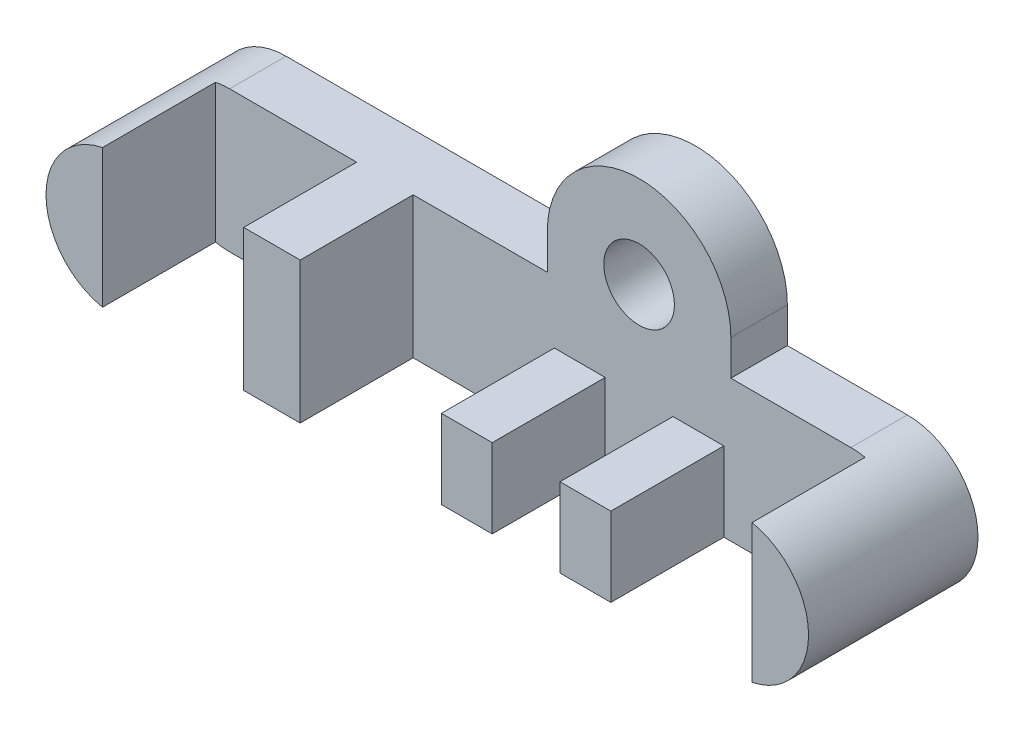
ISO-10303-21;
HEADER;
FILE_DESCRIPTION(('STEP AP214'),'2;1');
FILE_NAME('part.step','',(''),(''),'','','');
FILE_SCHEMA(('AUTOMOTIVE_DESIGN { 1 0 10303 214 1 1 1 1 }'));
ENDSEC;
DATA;
#1=APPLICATION_CONTEXT('core data for automotive mechanical design processes');
#2=APPLICATION_PROTOCOL_DEFINITION('international standard','automotive_design',2000,#1);
#3=PRODUCT_CONTEXT('',#1,'mechanical');
#4=PRODUCT('Part','Part','',(#3));
#5=PRODUCT_RELATED_PRODUCT_CATEGORY('part','',(#4));
#6=PRODUCT_DEFINITION_FORMATION('','',#4);
#7=PRODUCT_DEFINITION_CONTEXT('part definition',#1,'design');
#8=PRODUCT_DEFINITION('design','',#6,#7);
#9=PRODUCT_DEFINITION_SHAPE('','',#8);
#10=(LENGTH_UNIT() NAMED_UNIT(*) SI_UNIT(.MILLI.,.METRE.));
#11=(NAMED_UNIT(*) PLANE_ANGLE_UNIT() SI_UNIT($,.RADIAN.));
#12=(NAMED_UNIT(*) SI_UNIT($,.STERADIAN.) SOLID_ANGLE_UNIT());
#13=UNCERTAINTY_MEASURE_WITH_UNIT(LENGTH_MEASURE(1.E-05),#10,'distance_accuracy_value','');
#14=(GEOMETRIC_REPRESENTATION_CONTEXT(3) GLOBAL_UNCERTAINTY_ASSIGNED_CONTEXT((#13)) GLOBAL_UNIT_ASSIGNED_CONTEXT((#10,
#11,#12)) REPRESENTATION_CONTEXT('',''));
#15=CARTESIAN_POINT('',(0.,0.,0.));
#16=DIRECTION('',(0.,0.,1.));
#17=DIRECTION('',(1.,0.,0.));
#18=AXIS2_PLACEMENT_3D('',#15,#16,#17);
#19=CARTESIAN_POINT('',(-14.5,-3.75,2.));
#20=DIRECTION('',(0.,0.,1.));
#21=DIRECTION('',(1.,0.,0.));
#22=AXIS2_PLACEMENT_3D('',#19,#20,#21);
#23=PLANE('',#22);
#24=DIRECTION('',(1.,0.,0.));
#25=VECTOR('',#24,1.);
#26=CARTESIAN_POINT('',(-14.5,-6.25,2.));
#27=LINE('',#26,#25);
#28=CARTESIAN_POINT('',(-14.5,-6.25,2.));
#29=VERTEX_POINT('',#28);
#30=CARTESIAN_POINT('',(-10.,-6.25,2.));
#31=VERTEX_POINT('',#30);
#32=EDGE_CURVE('E69',#29,#31,#27,.T.);
#33=ORIENTED_EDGE('',*,*,#32,.T.);
#34=DIRECTION('',(0.,-1.,0.));
#35=VECTOR('',#34,1.);
#36=CARTESIAN_POINT('',(-10.,0.,2.));
#37=LINE('',#36,#35);
#38=CARTESIAN_POINT('',(-10.,-1.25,2.));
#39=VERTEX_POINT('',#38);
#40=EDGE_CURVE('E831',#39,#31,#37,.T.);
#41=ORIENTED_EDGE('',*,*,#40,.F.);
#42=DIRECTION('',(-1.,0.,0.));
#43=VECTOR('',#42,1.);
#44=CARTESIAN_POINT('',(-14.5,-1.25,2.));
#45=LINE('',#44,#43);
#46=CARTESIAN_POINT('',(-14.5,-1.25,2.));
#47=VERTEX_POINT('',#46);
#48=EDGE_CURVE('E232',#39,#47,#45,.T.);
#49=ORIENTED_EDGE('',*,*,#48,.T.);
#50=CARTESIAN_POINT('',(-14.5,-3.75,2.));
#51=DIRECTION('',(0.,0.,1.));
#52=DIRECTION('',(1.,0.,0.));
#53=AXIS2_PLACEMENT_3D('',#50,#51,#52);
#54=CIRCLE('',#53,2.5);
#55=CARTESIAN_POINT('',(-15.,-1.30051025721682,2.));
#56=VERTEX_POINT('',#55);
#57=EDGE_CURVE('E368',#47,#56,#54,.T.);
#58=ORIENTED_EDGE('',*,*,#57,.T.);
#59=DIRECTION('',(0.,-1.,0.));
#60=VECTOR('',#59,1.);
#61=CARTESIAN_POINT('',(-15.,0.,2.));
#62=LINE('',#61,#60);
#63=CARTESIAN_POINT('',(-15.,-6.19948974278318,2.));
#64=VERTEX_POINT('',#63);
#65=EDGE_CURVE('E234',#56,#64,#62,.T.);
#66=ORIENTED_EDGE('',*,*,#65,.T.);
#67=EDGE_CURVE('E372',#64,#29,#54,.T.);
#68=ORIENTED_EDGE('',*,*,#67,.T.);
#69=EDGE_LOOP('',(#33,#41,#49,#58,#66,#68));
#70=FACE_BOUND('',#69,.T.);
#71=ADVANCED_FACE('F45',(#70),#23,.T.);
#72=DIRECTION('',(0.,-1.,0.));
#73=VECTOR('',#72,1.);
#74=CARTESIAN_POINT('',(-8.,0.,2.));
#75=LINE('',#74,#73);
#76=CARTESIAN_POINT('',(-8.,-1.25,2.));
#77=VERTEX_POINT('',#76);
#78=CARTESIAN_POINT('',(-8.,-6.25,2.));
#79=VERTEX_POINT('',#78);
#80=EDGE_CURVE('E61',#77,#79,#75,.T.);
#81=ORIENTED_EDGE('',*,*,#80,.T.);
#82=CARTESIAN_POINT('',(-3.,-6.25,2.));
#83=VERTEX_POINT('',#82);
#84=EDGE_CURVE('E376',#79,#83,#27,.T.);
#85=ORIENTED_EDGE('',*,*,#84,.T.);
#86=DIRECTION('',(0.,-1.,0.));
#87=VECTOR('',#86,1.);
#88=CARTESIAN_POINT('',(-3.,0.,2.));
#89=LINE('',#88,#87);
#90=CARTESIAN_POINT('',(-3.,-3.45,2.));
#91=VERTEX_POINT('',#90);
#92=EDGE_CURVE('E325',#91,#83,#89,.T.);
#93=ORIENTED_EDGE('',*,*,#92,.F.);
#94=DIRECTION('',(1.,0.,0.));
#95=VECTOR('',#94,1.);
#96=CARTESIAN_POINT('',(0.,-3.45,2.));
#97=LINE('',#96,#95);
#98=CARTESIAN_POINT('',(-1.2,-3.45,2.));
#99=VERTEX_POINT('',#98);
#100=EDGE_CURVE('E339',#91,#99,#97,.T.);
#101=ORIENTED_EDGE('',*,*,#100,.T.);
#102=DIRECTION('',(0.,-1.,0.));
#103=VECTOR('',#102,1.);
#104=CARTESIAN_POINT('',(-1.2,0.,2.));
#105=LINE('',#104,#103);
#106=CARTESIAN_POINT('',(-1.2,-6.25,2.));
#107=VERTEX_POINT('',#106);
#108=EDGE_CURVE('E319',#99,#107,#105,.T.);
#109=ORIENTED_EDGE('',*,*,#108,.T.);
#110=CARTESIAN_POINT('',(1.2,-6.25,2.));
#111=VERTEX_POINT('',#110);
#112=EDGE_CURVE('E377',#107,#111,#27,.T.);
#113=ORIENTED_EDGE('',*,*,#112,.T.);
#114=DIRECTION('',(0.,-1.,0.));
#115=VECTOR('',#114,1.);
#116=CARTESIAN_POINT('',(1.2,0.,2.));
#117=LINE('',#116,#115);
#118=CARTESIAN_POINT('',(1.2,-3.45,2.));
#119=VERTEX_POINT('',#118);
#120=EDGE_CURVE('E297',#119,#111,#117,.T.);
#121=ORIENTED_EDGE('',*,*,#120,.F.);
#122=DIRECTION('',(1.,0.,0.));
#123=VECTOR('',#122,1.);
#124=CARTESIAN_POINT('',(0.,-3.45,2.));
#125=LINE('',#124,#123);
#126=CARTESIAN_POINT('',(3.,-3.45,2.));
#127=VERTEX_POINT('',#126);
#128=EDGE_CURVE('E278',#119,#127,#125,.T.);
#129=ORIENTED_EDGE('',*,*,#128,.T.);
#130=DIRECTION('',(0.,-1.,0.));
#131=VECTOR('',#130,1.);
#132=CARTESIAN_POINT('',(3.,0.,2.));
#133=LINE('',#132,#131);
#134=CARTESIAN_POINT('',(3.,-6.25,2.));
#135=VERTEX_POINT('',#134);
#136=EDGE_CURVE('E284',#127,#135,#133,.T.);
#137=ORIENTED_EDGE('',*,*,#136,.T.);
#138=CARTESIAN_POINT('',(7.5,-6.25,2.));
#139=VERTEX_POINT('',#138);
#140=EDGE_CURVE('E371',#135,#139,#27,.T.);
#141=ORIENTED_EDGE('',*,*,#140,.T.);
#142=CARTESIAN_POINT('',(7.5,-3.75,2.));
#143=DIRECTION('',(0.,0.,1.));
#144=DIRECTION('',(1.,0.,0.));
#145=AXIS2_PLACEMENT_3D('',#142,#143,#144);
#146=CIRCLE('',#145,2.5);
#147=CARTESIAN_POINT('',(8.,-6.19948974278318,2.));
#148=VERTEX_POINT('',#147);
#149=EDGE_CURVE('E378',#139,#148,#146,.T.);
#150=ORIENTED_EDGE('',*,*,#149,.T.);
#151=DIRECTION('',(0.,-1.,0.));
#152=VECTOR('',#151,1.);
#153=CARTESIAN_POINT('',(8.,0.,2.));
#154=LINE('',#153,#152);
#155=CARTESIAN_POINT('',(8.,-1.30051025721682,2.));
#156=VERTEX_POINT('',#155);
#157=EDGE_CURVE('E259',#156,#148,#154,.T.);
#158=ORIENTED_EDGE('',*,*,#157,.F.);
#159=CARTESIAN_POINT('',(7.5,-1.25,2.));
#160=VERTEX_POINT('',#159);
#161=EDGE_CURVE('E375',#156,#160,#146,.T.);
#162=ORIENTED_EDGE('',*,*,#161,.T.);
#163=DIRECTION('',(-1.,0.,0.));
#164=VECTOR('',#163,1.);
#165=CARTESIAN_POINT('',(3.25,-1.25,2.));
#166=LINE('',#165,#164);
#167=CARTESIAN_POINT('',(3.25,-1.25,2.));
#168=VERTEX_POINT('',#167);
#169=EDGE_CURVE('E381',#160,#168,#166,.T.);
#170=ORIENTED_EDGE('',*,*,#169,.T.);
#171=DIRECTION('',(0.,1.,0.));
#172=VECTOR('',#171,1.);
#173=CARTESIAN_POINT('',(3.25,0.,2.));
#174=LINE('',#173,#172);
#175=CARTESIAN_POINT('',(3.25,0.,2.));
#176=VERTEX_POINT('',#175);
#177=EDGE_CURVE('E384',#168,#176,#174,.T.);
#178=ORIENTED_EDGE('',*,*,#177,.T.);
#179=CARTESIAN_POINT('',(0.,0.,2.));
#180=DIRECTION('',(0.,0.,1.));
#181=DIRECTION('',(1.,0.,0.));
#182=AXIS2_PLACEMENT_3D('',#179,#180,#181);
#183=CIRCLE('',#182,3.25);
#184=CARTESIAN_POINT('',(-3.25,0.,2.));
#185=VERTEX_POINT('',#184);
#186=EDGE_CURVE('E387',#176,#185,#183,.T.);
#187=ORIENTED_EDGE('',*,*,#186,.T.);
#188=DIRECTION('',(0.,-1.,0.));
#189=VECTOR('',#188,1.);
#190=CARTESIAN_POINT('',(-3.25,0.,2.));
#191=LINE('',#190,#189);
#192=CARTESIAN_POINT('',(-3.25,-1.25,2.));
#193=VERTEX_POINT('',#192);
#194=EDGE_CURVE('E390',#185,#193,#191,.T.);
#195=ORIENTED_EDGE('',*,*,#194,.T.);
#196=EDGE_CURVE('E393',#193,#77,#45,.T.);
#197=ORIENTED_EDGE('',*,*,#196,.T.);
#198=EDGE_LOOP('',(#81,#85,#93,#101,#109,#113,#121,#129,#137,#141,#150,#158,#162,#170,#178,#187,
#195,#197));
#199=FACE_BOUND('',#198,.T.);
#200=CARTESIAN_POINT('',(0.,0.,2.));
#201=DIRECTION('',(0.,0.,1.));
#202=DIRECTION('',(1.,0.,0.));
#203=AXIS2_PLACEMENT_3D('',#200,#201,#202);
#204=CIRCLE('',#203,1.25);
#205=CARTESIAN_POINT('',(1.25,0.,2.));
#206=VERTEX_POINT('',#205);
#207=EDGE_CURVE('E360',#206,#206,#204,.T.);
#208=ORIENTED_EDGE('',*,*,#207,.F.);
#209=EDGE_LOOP('',(#208));
#210=FACE_BOUND('',#209,.T.);
#211=ADVANCED_FACE('F468',(#199,#210),#23,.T.);
#212=CARTESIAN_POINT('',(-14.5,-3.75,0.));
#213=DIRECTION('',(0.,0.,1.));
#214=DIRECTION('',(1.,0.,0.));
#215=AXIS2_PLACEMENT_3D('',#212,#213,#214);
#216=PLANE('',#215);
#217=CARTESIAN_POINT('',(-14.5,-3.75,0.));
#218=DIRECTION('',(0.,0.,1.));
#219=DIRECTION('',(1.,0.,0.));
#220=AXIS2_PLACEMENT_3D('',#217,#218,#219);
#221=CIRCLE('',#220,2.5);
#222=CARTESIAN_POINT('',(-14.5,-1.25,0.));
#223=VERTEX_POINT('',#222);
#224=CARTESIAN_POINT('',(-14.5,-6.25,0.));
#225=VERTEX_POINT('',#224);
#226=EDGE_CURVE('E364',#223,#225,#221,.T.);
#227=ORIENTED_EDGE('',*,*,#226,.F.);
#228=DIRECTION('',(-1.,0.,0.));
#229=VECTOR('',#228,1.);
#230=CARTESIAN_POINT('',(-14.5,-1.25,0.));
#231=LINE('',#230,#229);
#232=CARTESIAN_POINT('',(-3.25,-1.25,0.));
#233=VERTEX_POINT('',#232);
#234=EDGE_CURVE('E418',#233,#223,#231,.T.);
#235=ORIENTED_EDGE('',*,*,#234,.F.);
#236=DIRECTION('',(0.,-1.,0.));
#237=VECTOR('',#236,1.);
#238=CARTESIAN_POINT('',(-3.25,0.,0.));
#239=LINE('',#238,#237);
#240=CARTESIAN_POINT('',(-3.25,0.,0.));
#241=VERTEX_POINT('',#240);
#242=EDGE_CURVE('E415',#241,#233,#239,.T.);
#243=ORIENTED_EDGE('',*,*,#242,.F.);
#244=CARTESIAN_POINT('',(0.,0.,0.));
#245=DIRECTION('',(0.,0.,1.));
#246=DIRECTION('',(1.,0.,0.));
#247=AXIS2_PLACEMENT_3D('',#244,#245,#246);
#248=CIRCLE('',#247,3.25);
#249=CARTESIAN_POINT('',(3.25,0.,0.));
#250=VERTEX_POINT('',#249);
#251=EDGE_CURVE('E412',#250,#241,#248,.T.);
#252=ORIENTED_EDGE('',*,*,#251,.F.);
#253=DIRECTION('',(0.,1.,0.));
#254=VECTOR('',#253,1.);
#255=CARTESIAN_POINT('',(3.25,0.,0.));
#256=LINE('',#255,#254);
#257=CARTESIAN_POINT('',(3.25,-1.25,0.));
#258=VERTEX_POINT('',#257);
#259=EDGE_CURVE('E409',#258,#250,#256,.T.);
#260=ORIENTED_EDGE('',*,*,#259,.F.);
#261=DIRECTION('',(-1.,0.,0.));
#262=VECTOR('',#261,1.);
#263=CARTESIAN_POINT('',(3.25,-1.25,0.));
#264=LINE('',#263,#262);
#265=CARTESIAN_POINT('',(7.5,-1.25,0.));
#266=VERTEX_POINT('',#265);
#267=EDGE_CURVE('E406',#266,#258,#264,.T.);
#268=ORIENTED_EDGE('',*,*,#267,.F.);
#269=CARTESIAN_POINT('',(7.5,-3.75,0.));
#270=DIRECTION('',(0.,0.,1.));
#271=DIRECTION('',(1.,0.,0.));
#272=AXIS2_PLACEMENT_3D('',#269,#270,#271);
#273=CIRCLE('',#272,2.5);
#274=CARTESIAN_POINT('',(7.5,-6.25,0.));
#275=VERTEX_POINT('',#274);
#276=EDGE_CURVE('E403',#275,#266,#273,.T.);
#277=ORIENTED_EDGE('',*,*,#276,.F.);
#278=DIRECTION('',(1.,0.,0.));
#279=VECTOR('',#278,1.);
#280=CARTESIAN_POINT('',(-14.5,-6.25,0.));
#281=LINE('',#280,#279);
#282=EDGE_CURVE('E400',#225,#275,#281,.T.);
#283=ORIENTED_EDGE('',*,*,#282,.F.);
#284=EDGE_LOOP('',(#227,#235,#243,#252,#260,#268,#277,#283));
#285=FACE_BOUND('',#284,.T.);
#286=CARTESIAN_POINT('',(0.,0.,0.));
#287=DIRECTION('',(0.,0.,1.));
#288=DIRECTION('',(1.,0.,0.));
#289=AXIS2_PLACEMENT_3D('',#286,#287,#288);
#290=CIRCLE('',#289,1.25);
#291=CARTESIAN_POINT('',(1.25,0.,0.));
#292=VERTEX_POINT('',#291);
#293=EDGE_CURVE('E359',#292,#292,#290,.T.);
#294=ORIENTED_EDGE('',*,*,#293,.T.);
#295=EDGE_LOOP('',(#294));
#296=FACE_BOUND('',#295,.T.);
#297=ADVANCED_FACE('F455',(#285,#296),#216,.F.);
#298=CARTESIAN_POINT('',(-14.5,-3.75,2.));
#299=DIRECTION('',(0.,0.,-1.));
#300=DIRECTION('',(-1.,0.,0.));
#301=AXIS2_PLACEMENT_3D('',#298,#299,#300);
#302=CYLINDRICAL_SURFACE('',#301,2.5);
#303=ORIENTED_EDGE('',*,*,#226,.T.);
#304=DIRECTION('',(0.,0.,-1.));
#305=VECTOR('',#304,1.);
#306=CARTESIAN_POINT('',(-14.5,-6.25,2.));
#307=LINE('',#306,#305);
#308=EDGE_CURVE('E11',#29,#225,#307,.T.);
#309=ORIENTED_EDGE('',*,*,#308,.F.);
#310=ORIENTED_EDGE('',*,*,#67,.F.);
#311=DIRECTION('',(0.,0.,-1.));
#312=VECTOR('',#311,1.);
#313=CARTESIAN_POINT('',(-15.,-6.19948974278318,6.));
#314=LINE('',#313,#312);
#315=CARTESIAN_POINT('',(-15.,-6.19948974278318,6.));
#316=VERTEX_POINT('',#315);
#317=EDGE_CURVE('E250',#316,#64,#314,.T.);
#318=ORIENTED_EDGE('',*,*,#317,.F.);
#319=CARTESIAN_POINT('',(-14.5,-3.75,6.));
#320=DIRECTION('',(0.,0.,1.));
#321=DIRECTION('',(1.,0.,0.));
#322=AXIS2_PLACEMENT_3D('',#319,#320,#321);
#323=CIRCLE('',#322,2.5);
#324=CARTESIAN_POINT('',(-15.,-1.30051025721682,6.));
#325=VERTEX_POINT('',#324);
#326=EDGE_CURVE('E248',#325,#316,#323,.T.);
#327=ORIENTED_EDGE('',*,*,#326,.F.);
#328=DIRECTION('',(0.,0.,-1.));
#329=VECTOR('',#328,1.);
#330=CARTESIAN_POINT('',(-15.,-1.30051025721682,6.));
#331=LINE('',#330,#329);
#332=EDGE_CURVE('E255',#325,#56,#331,.T.);
#333=ORIENTED_EDGE('',*,*,#332,.T.);
#334=ORIENTED_EDGE('',*,*,#57,.F.);
#335=DIRECTION('',(0.,0.,-1.));
#336=VECTOR('',#335,1.);
#337=CARTESIAN_POINT('',(-14.5,-1.25,2.));
#338=LINE('',#337,#336);
#339=EDGE_CURVE('E396',#47,#223,#338,.T.);
#340=ORIENTED_EDGE('',*,*,#339,.T.);
#341=EDGE_LOOP('',(#303,#309,#310,#318,#327,#333,#334,#340));
#342=FACE_BOUND('',#341,.T.);
#343=ADVANCED_FACE('F47',(#342),#302,.T.);
#344=CARTESIAN_POINT('',(-14.5,-6.25,2.));
#345=DIRECTION('',(0.,1.,0.));
#346=DIRECTION('',(0.,0.,1.));
#347=AXIS2_PLACEMENT_3D('',#344,#345,#346);
#348=PLANE('',#347);
#349=ORIENTED_EDGE('',*,*,#282,.T.);
#350=DIRECTION('',(0.,0.,-1.));
#351=VECTOR('',#350,1.);
#352=CARTESIAN_POINT('',(7.5,-6.25,2.));
#353=LINE('',#352,#351);
#354=EDGE_CURVE('E54',#139,#275,#353,.T.);
#355=ORIENTED_EDGE('',*,*,#354,.F.);
#356=ORIENTED_EDGE('',*,*,#140,.F.);
#357=DIRECTION('',(0.,0.,-1.));
#358=VECTOR('',#357,1.);
#359=CARTESIAN_POINT('',(3.,-6.25,6.));
#360=LINE('',#359,#358);
#361=CARTESIAN_POINT('',(3.,-6.25,6.));
#362=VERTEX_POINT('',#361);
#363=EDGE_CURVE('E307',#362,#135,#360,.T.);
#364=ORIENTED_EDGE('',*,*,#363,.F.);
#365=DIRECTION('',(1.,0.,0.));
#366=VECTOR('',#365,1.);
#367=CARTESIAN_POINT('',(0.,-6.25,6.));
#368=LINE('',#367,#366);
#369=CARTESIAN_POINT('',(1.2,-6.25,6.));
#370=VERTEX_POINT('',#369);
#371=EDGE_CURVE('E287',#370,#362,#368,.T.);
#372=ORIENTED_EDGE('',*,*,#371,.F.);
#373=DIRECTION('',(0.,0.,-1.));
#374=VECTOR('',#373,1.);
#375=CARTESIAN_POINT('',(1.2,-6.25,6.));
#376=LINE('',#375,#374);
#377=EDGE_CURVE('E311',#370,#111,#376,.T.);
#378=ORIENTED_EDGE('',*,*,#377,.T.);
#379=ORIENTED_EDGE('',*,*,#112,.F.);
#380=DIRECTION('',(0.,0.,-1.));
#381=VECTOR('',#380,1.);
#382=CARTESIAN_POINT('',(-1.2,-6.25,6.));
#383=LINE('',#382,#381);
#384=CARTESIAN_POINT('',(-1.2,-6.25,6.));
#385=VERTEX_POINT('',#384);
#386=EDGE_CURVE('E335',#385,#107,#383,.T.);
#387=ORIENTED_EDGE('',*,*,#386,.F.);
#388=DIRECTION('',(1.,0.,0.));
#389=VECTOR('',#388,1.);
#390=CARTESIAN_POINT('',(0.,-6.25,6.));
#391=LINE('',#390,#389);
#392=CARTESIAN_POINT('',(-3.,-6.25,6.));
#393=VERTEX_POINT('',#392);
#394=EDGE_CURVE('E332',#393,#385,#391,.T.);
#395=ORIENTED_EDGE('',*,*,#394,.F.);
#396=DIRECTION('',(0.,0.,-1.));
#397=VECTOR('',#396,1.);
#398=CARTESIAN_POINT('',(-3.,-6.25,6.));
#399=LINE('',#398,#397);
#400=EDGE_CURVE('E348',#393,#83,#399,.T.);
#401=ORIENTED_EDGE('',*,*,#400,.T.);
#402=ORIENTED_EDGE('',*,*,#84,.F.);
#403=DIRECTION('',(0.,0.,-1.));
#404=VECTOR('',#403,1.);
#405=CARTESIAN_POINT('',(-8.,-6.25,6.));
#406=LINE('',#405,#404);
#407=CARTESIAN_POINT('',(-8.,-6.25,6.));
#408=VERTEX_POINT('',#407);
#409=EDGE_CURVE('E241',#408,#79,#406,.T.);
#410=ORIENTED_EDGE('',*,*,#409,.F.);
#411=DIRECTION('',(1.,0.,0.));
#412=VECTOR('',#411,1.);
#413=CARTESIAN_POINT('',(0.,-6.25,6.));
#414=LINE('',#413,#412);
#415=CARTESIAN_POINT('',(-10.,-6.25,6.));
#416=VERTEX_POINT('',#415);
#417=EDGE_CURVE('E218',#416,#408,#414,.T.);
#418=ORIENTED_EDGE('',*,*,#417,.F.);
#419=DIRECTION('',(0.,0.,-1.));
#420=VECTOR('',#419,1.);
#421=CARTESIAN_POINT('',(-10.,-6.25,6.));
#422=LINE('',#421,#420);
#423=EDGE_CURVE('E214',#416,#31,#422,.T.);
#424=ORIENTED_EDGE('',*,*,#423,.T.);
#425=ORIENTED_EDGE('',*,*,#32,.F.);
#426=ORIENTED_EDGE('',*,*,#308,.T.);
#427=EDGE_LOOP('',(#349,#355,#356,#364,#372,#378,#379,#387,#395,#401,#402,#410,#418,#424,#425,#426));
#428=FACE_BOUND('',#427,.T.);
#429=ADVANCED_FACE('F482',(#428),#348,.F.);
#430=CARTESIAN_POINT('',(7.5,-3.75,2.));
#431=DIRECTION('',(0.,0.,-1.));
#432=DIRECTION('',(-1.,0.,0.));
#433=AXIS2_PLACEMENT_3D('',#430,#431,#432);
#434=CYLINDRICAL_SURFACE('',#433,2.5);
#435=ORIENTED_EDGE('',*,*,#276,.T.);
#436=DIRECTION('',(0.,0.,-1.));
#437=VECTOR('',#436,1.);
#438=CARTESIAN_POINT('',(7.5,-1.25,2.));
#439=LINE('',#438,#437);
#440=EDGE_CURVE('E440',#160,#266,#439,.T.);
#441=ORIENTED_EDGE('',*,*,#440,.F.);
#442=ORIENTED_EDGE('',*,*,#161,.F.);
#443=DIRECTION('',(0.,0.,-1.));
#444=VECTOR('',#443,1.);
#445=CARTESIAN_POINT('',(8.,-1.30051025721682,6.));
#446=LINE('',#445,#444);
#447=CARTESIAN_POINT('',(8.,-1.30051025721682,6.));
#448=VERTEX_POINT('',#447);
#449=EDGE_CURVE('E274',#448,#156,#446,.T.);
#450=ORIENTED_EDGE('',*,*,#449,.F.);
#451=CARTESIAN_POINT('',(7.5,-3.75,6.));
#452=DIRECTION('',(0.,0.,1.));
#453=DIRECTION('',(1.,0.,0.));
#454=AXIS2_PLACEMENT_3D('',#451,#452,#453);
#455=CIRCLE('',#454,2.5);
#456=CARTESIAN_POINT('',(8.,-6.19948974278318,6.));
#457=VERTEX_POINT('',#456);
#458=EDGE_CURVE('E260',#457,#448,#455,.T.);
#459=ORIENTED_EDGE('',*,*,#458,.F.);
#460=DIRECTION('',(0.,0.,-1.));
#461=VECTOR('',#460,1.);
#462=CARTESIAN_POINT('',(8.,-6.19948974278318,6.));
#463=LINE('',#462,#461);
#464=EDGE_CURVE('E267',#457,#148,#463,.T.);
#465=ORIENTED_EDGE('',*,*,#464,.T.);
#466=ORIENTED_EDGE('',*,*,#149,.F.);
#467=ORIENTED_EDGE('',*,*,#354,.T.);
#468=EDGE_LOOP('',(#435,#441,#442,#450,#459,#465,#466,#467));
#469=FACE_BOUND('',#468,.T.);
#470=ADVANCED_FACE('F449',(#469),#434,.T.);
#471=CARTESIAN_POINT('',(3.25,-1.25,2.));
#472=DIRECTION('',(0.,-1.,0.));
#473=DIRECTION('',(0.,0.,-1.));
#474=AXIS2_PLACEMENT_3D('',#471,#472,#473);
#475=PLANE('',#474);
#476=ORIENTED_EDGE('',*,*,#267,.T.);
#477=DIRECTION('',(0.,0.,-1.));
#478=VECTOR('',#477,1.);
#479=CARTESIAN_POINT('',(3.25,-1.25,2.));
#480=LINE('',#479,#478);
#481=EDGE_CURVE('E436',#168,#258,#480,.T.);
#482=ORIENTED_EDGE('',*,*,#481,.F.);
#483=ORIENTED_EDGE('',*,*,#169,.F.);
#484=ORIENTED_EDGE('',*,*,#440,.T.);
#485=EDGE_LOOP('',(#476,#482,#483,#484));
#486=FACE_BOUND('',#485,.T.);
#487=ADVANCED_FACE('F461',(#486),#475,.F.);
#488=CARTESIAN_POINT('',(3.25,0.,2.));
#489=DIRECTION('',(-1.,0.,0.));
#490=DIRECTION('',(0.,0.,1.));
#491=AXIS2_PLACEMENT_3D('',#488,#489,#490);
#492=PLANE('',#491);
#493=ORIENTED_EDGE('',*,*,#259,.T.);
#494=DIRECTION('',(0.,0.,-1.));
#495=VECTOR('',#494,1.);
#496=CARTESIAN_POINT('',(3.25,0.,2.));
#497=LINE('',#496,#495);
#498=EDGE_CURVE('E432',#176,#250,#497,.T.);
#499=ORIENTED_EDGE('',*,*,#498,.F.);
#500=ORIENTED_EDGE('',*,*,#177,.F.);
#501=ORIENTED_EDGE('',*,*,#481,.T.);
#502=EDGE_LOOP('',(#493,#499,#500,#501));
#503=FACE_BOUND('',#502,.T.);
#504=ADVANCED_FACE('F465',(#503),#492,.F.);
#505=CARTESIAN_POINT('',(0.,0.,2.));
#506=DIRECTION('',(0.,0.,-1.));
#507=DIRECTION('',(-1.,0.,0.));
#508=AXIS2_PLACEMENT_3D('',#505,#506,#507);
#509=CYLINDRICAL_SURFACE('',#508,3.25);
#510=ORIENTED_EDGE('',*,*,#251,.T.);
#511=DIRECTION('',(0.,0.,-1.));
#512=VECTOR('',#511,1.);
#513=CARTESIAN_POINT('',(-3.25,0.,2.));
#514=LINE('',#513,#512);
#515=EDGE_CURVE('E428',#185,#241,#514,.T.);
#516=ORIENTED_EDGE('',*,*,#515,.F.);
#517=ORIENTED_EDGE('',*,*,#186,.F.);
#518=ORIENTED_EDGE('',*,*,#498,.T.);
#519=EDGE_LOOP('',(#510,#516,#517,#518));
#520=FACE_BOUND('',#519,.T.);
#521=ADVANCED_FACE('F492',(#520),#509,.T.);
#522=CARTESIAN_POINT('',(-3.25,0.,2.));
#523=DIRECTION('',(1.,0.,0.));
#524=DIRECTION('',(0.,0.,-1.));
#525=AXIS2_PLACEMENT_3D('',#522,#523,#524);
#526=PLANE('',#525);
#527=ORIENTED_EDGE('',*,*,#242,.T.);
#528=DIRECTION('',(0.,0.,-1.));
#529=VECTOR('',#528,1.);
#530=CARTESIAN_POINT('',(-3.25,-1.25,2.));
#531=LINE('',#530,#529);
#532=EDGE_CURVE('E424',#193,#233,#531,.T.);
#533=ORIENTED_EDGE('',*,*,#532,.F.);
#534=ORIENTED_EDGE('',*,*,#194,.F.);
#535=ORIENTED_EDGE('',*,*,#515,.T.);
#536=EDGE_LOOP('',(#527,#533,#534,#535));
#537=FACE_BOUND('',#536,.T.);
#538=ADVANCED_FACE('F490',(#537),#526,.F.);
#539=CARTESIAN_POINT('',(-14.5,-1.25,2.));
#540=DIRECTION('',(0.,-1.,0.));
#541=DIRECTION('',(0.,0.,-1.));
#542=AXIS2_PLACEMENT_3D('',#539,#540,#541);
#543=PLANE('',#542);
#544=ORIENTED_EDGE('',*,*,#234,.T.);
#545=ORIENTED_EDGE('',*,*,#339,.F.);
#546=ORIENTED_EDGE('',*,*,#48,.F.);
#547=DIRECTION('',(0.,0.,-1.));
#548=VECTOR('',#547,1.);
#549=CARTESIAN_POINT('',(-10.,-1.25,6.));
#550=LINE('',#549,#548);
#551=CARTESIAN_POINT('',(-10.,-1.25,6.));
#552=VERTEX_POINT('',#551);
#553=EDGE_CURVE('E212',#552,#39,#550,.T.);
#554=ORIENTED_EDGE('',*,*,#553,.F.);
#555=DIRECTION('',(-1.,0.,0.));
#556=VECTOR('',#555,1.);
#557=CARTESIAN_POINT('',(0.,-1.25,6.));
#558=LINE('',#557,#556);
#559=CARTESIAN_POINT('',(-8.,-1.25,6.));
#560=VERTEX_POINT('',#559);
#561=EDGE_CURVE('E219',#560,#552,#558,.T.);
#562=ORIENTED_EDGE('',*,*,#561,.F.);
#563=DIRECTION('',(0.,0.,-1.));
#564=VECTOR('',#563,1.);
#565=CARTESIAN_POINT('',(-8.,-1.25,6.));
#566=LINE('',#565,#564);
#567=EDGE_CURVE('E828',#560,#77,#566,.T.);
#568=ORIENTED_EDGE('',*,*,#567,.T.);
#569=ORIENTED_EDGE('',*,*,#196,.F.);
#570=ORIENTED_EDGE('',*,*,#532,.T.);
#571=EDGE_LOOP('',(#544,#545,#546,#554,#562,#568,#569,#570));
#572=FACE_BOUND('',#571,.T.);
#573=ADVANCED_FACE('F230',(#572),#543,.F.);
#574=CARTESIAN_POINT('',(0.,0.,2.));
#575=DIRECTION('',(0.,0.,-1.));
#576=DIRECTION('',(-1.,0.,0.));
#577=AXIS2_PLACEMENT_3D('',#574,#575,#576);
#578=CYLINDRICAL_SURFACE('',#577,1.25);
#579=ORIENTED_EDGE('',*,*,#207,.T.);
#580=EDGE_LOOP('',(#579));
#581=FACE_BOUND('',#580,.T.);
#582=ORIENTED_EDGE('',*,*,#293,.F.);
#583=EDGE_LOOP('',(#582));
#584=FACE_BOUND('',#583,.T.);
#585=ADVANCED_FACE('F508',(#581,#584),#578,.F.);
#586=CARTESIAN_POINT('',(-1.2,0.,6.));
#587=DIRECTION('',(1.,0.,0.));
#588=DIRECTION('',(0.,1.,0.));
#589=AXIS2_PLACEMENT_3D('',#586,#587,#588);
#590=PLANE('',#589);
#591=ORIENTED_EDGE('',*,*,#108,.F.);
#592=DIRECTION('',(0.,0.,-1.));
#593=VECTOR('',#592,1.);
#594=CARTESIAN_POINT('',(-1.2,-3.45,6.));
#595=LINE('',#594,#593);
#596=CARTESIAN_POINT('',(-1.2,-3.45,6.));
#597=VERTEX_POINT('',#596);
#598=EDGE_CURVE('E355',#597,#99,#595,.T.);
#599=ORIENTED_EDGE('',*,*,#598,.F.);
#600=DIRECTION('',(0.,-1.,0.));
#601=VECTOR('',#600,1.);
#602=CARTESIAN_POINT('',(-1.2,0.,6.));
#603=LINE('',#602,#601);
#604=EDGE_CURVE('E320',#597,#385,#603,.T.);
#605=ORIENTED_EDGE('',*,*,#604,.T.);
#606=ORIENTED_EDGE('',*,*,#386,.T.);
#607=EDGE_LOOP('',(#591,#599,#605,#606));
#608=FACE_BOUND('',#607,.T.);
#609=ADVANCED_FACE('F516',(#608),#590,.T.);
#610=CARTESIAN_POINT('',(0.,-3.45,6.));
#611=DIRECTION('',(0.,1.,0.));
#612=DIRECTION('',(-1.,0.,0.));
#613=AXIS2_PLACEMENT_3D('',#610,#611,#612);
#614=PLANE('',#613);
#615=ORIENTED_EDGE('',*,*,#100,.F.);
#616=DIRECTION('',(0.,0.,-1.));
#617=VECTOR('',#616,1.);
#618=CARTESIAN_POINT('',(-3.,-3.45,6.));
#619=LINE('',#618,#617);
#620=CARTESIAN_POINT('',(-3.,-3.45,6.));
#621=VERTEX_POINT('',#620);
#622=EDGE_CURVE('E352',#621,#91,#619,.T.);
#623=ORIENTED_EDGE('',*,*,#622,.F.);
#624=DIRECTION('',(1.,0.,0.));
#625=VECTOR('',#624,1.);
#626=CARTESIAN_POINT('',(0.,-3.45,6.));
#627=LINE('',#626,#625);
#628=EDGE_CURVE('E324',#621,#597,#627,.T.);
#629=ORIENTED_EDGE('',*,*,#628,.T.);
#630=ORIENTED_EDGE('',*,*,#598,.T.);
#631=EDGE_LOOP('',(#615,#623,#629,#630));
#632=FACE_BOUND('',#631,.T.);
#633=ADVANCED_FACE('F521',(#632),#614,.T.);
#634=CARTESIAN_POINT('',(-3.,0.,6.));
#635=DIRECTION('',(1.,0.,0.));
#636=DIRECTION('',(0.,0.,-1.));
#637=AXIS2_PLACEMENT_3D('',#634,#635,#636);
#638=PLANE('',#637);
#639=ORIENTED_EDGE('',*,*,#92,.T.);
#640=ORIENTED_EDGE('',*,*,#400,.F.);
#641=DIRECTION('',(0.,-1.,0.));
#642=VECTOR('',#641,1.);
#643=CARTESIAN_POINT('',(-3.,0.,6.));
#644=LINE('',#643,#642);
#645=EDGE_CURVE('E329',#621,#393,#644,.T.);
#646=ORIENTED_EDGE('',*,*,#645,.F.);
#647=ORIENTED_EDGE('',*,*,#622,.T.);
#648=EDGE_LOOP('',(#639,#640,#646,#647));
#649=FACE_BOUND('',#648,.T.);
#650=ADVANCED_FACE('F529',(#649),#638,.F.);
#651=CARTESIAN_POINT('',(0.,0.,6.));
#652=DIRECTION('',(0.,0.,1.));
#653=DIRECTION('',(1.,0.,0.));
#654=AXIS2_PLACEMENT_3D('',#651,#652,#653);
#655=PLANE('',#654);
#656=ORIENTED_EDGE('',*,*,#604,.F.);
#657=ORIENTED_EDGE('',*,*,#628,.F.);
#658=ORIENTED_EDGE('',*,*,#645,.T.);
#659=ORIENTED_EDGE('',*,*,#394,.T.);
#660=EDGE_LOOP('',(#656,#657,#658,#659));
#661=FACE_BOUND('',#660,.T.);
#662=ADVANCED_FACE('F535',(#661),#655,.T.);
#663=CARTESIAN_POINT('',(0.,-3.45,6.));
#664=DIRECTION('',(0.,1.,0.));
#665=DIRECTION('',(-1.,0.,0.));
#666=AXIS2_PLACEMENT_3D('',#663,#664,#665);
#667=PLANE('',#666);
#668=ORIENTED_EDGE('',*,*,#128,.F.);
#669=DIRECTION('',(0.,0.,-1.));
#670=VECTOR('',#669,1.);
#671=CARTESIAN_POINT('',(1.2,-3.45,6.));
#672=LINE('',#671,#670);
#673=CARTESIAN_POINT('',(1.2,-3.45,6.));
#674=VERTEX_POINT('',#673);
#675=EDGE_CURVE('E315',#674,#119,#672,.T.);
#676=ORIENTED_EDGE('',*,*,#675,.F.);
#677=DIRECTION('',(1.,0.,0.));
#678=VECTOR('',#677,1.);
#679=CARTESIAN_POINT('',(0.,-3.45,6.));
#680=LINE('',#679,#678);
#681=CARTESIAN_POINT('',(3.,-3.45,6.));
#682=VERTEX_POINT('',#681);
#683=EDGE_CURVE('E279',#674,#682,#680,.T.);
#684=ORIENTED_EDGE('',*,*,#683,.T.);
#685=DIRECTION('',(0.,0.,-1.));
#686=VECTOR('',#685,1.);
#687=CARTESIAN_POINT('',(3.,-3.45,6.));
#688=LINE('',#687,#686);
#689=EDGE_CURVE('E294',#682,#127,#688,.T.);
#690=ORIENTED_EDGE('',*,*,#689,.T.);
#691=EDGE_LOOP('',(#668,#676,#684,#690));
#692=FACE_BOUND('',#691,.T.);
#693=ADVANCED_FACE('F539',(#692),#667,.T.);
#694=CARTESIAN_POINT('',(1.2,0.,6.));
#695=DIRECTION('',(1.,0.,0.));
#696=DIRECTION('',(0.,1.,0.));
#697=AXIS2_PLACEMENT_3D('',#694,#695,#696);
#698=PLANE('',#697);
#699=ORIENTED_EDGE('',*,*,#120,.T.);
#700=ORIENTED_EDGE('',*,*,#377,.F.);
#701=DIRECTION('',(0.,-1.,0.));
#702=VECTOR('',#701,1.);
#703=CARTESIAN_POINT('',(1.2,0.,6.));
#704=LINE('',#703,#702);
#705=EDGE_CURVE('E283',#674,#370,#704,.T.);
#706=ORIENTED_EDGE('',*,*,#705,.F.);
#707=ORIENTED_EDGE('',*,*,#675,.T.);
#708=EDGE_LOOP('',(#699,#700,#706,#707));
#709=FACE_BOUND('',#708,.T.);
#710=ADVANCED_FACE('F543',(#709),#698,.F.);
#711=CARTESIAN_POINT('',(3.,0.,6.));
#712=DIRECTION('',(1.,0.,0.));
#713=DIRECTION('',(0.,1.,0.));
#714=AXIS2_PLACEMENT_3D('',#711,#712,#713);
#715=PLANE('',#714);
#716=ORIENTED_EDGE('',*,*,#136,.F.);
#717=ORIENTED_EDGE('',*,*,#689,.F.);
#718=DIRECTION('',(0.,-1.,0.));
#719=VECTOR('',#718,1.);
#720=CARTESIAN_POINT('',(3.,0.,6.));
#721=LINE('',#720,#719);
#722=EDGE_CURVE('E290',#682,#362,#721,.T.);
#723=ORIENTED_EDGE('',*,*,#722,.T.);
#724=ORIENTED_EDGE('',*,*,#363,.T.);
#725=EDGE_LOOP('',(#716,#717,#723,#724));
#726=FACE_BOUND('',#725,.T.);
#727=ADVANCED_FACE('F547',(#726),#715,.T.);
#728=CARTESIAN_POINT('',(0.,0.,6.));
#729=DIRECTION('',(0.,0.,1.));
#730=DIRECTION('',(1.,0.,0.));
#731=AXIS2_PLACEMENT_3D('',#728,#729,#730);
#732=PLANE('',#731);
#733=ORIENTED_EDGE('',*,*,#683,.F.);
#734=ORIENTED_EDGE('',*,*,#705,.T.);
#735=ORIENTED_EDGE('',*,*,#371,.T.);
#736=ORIENTED_EDGE('',*,*,#722,.F.);
#737=EDGE_LOOP('',(#733,#734,#735,#736));
#738=FACE_BOUND('',#737,.T.);
#739=ADVANCED_FACE('F551',(#738),#732,.T.);
#740=CARTESIAN_POINT('',(8.,0.,6.));
#741=DIRECTION('',(1.,0.,0.));
#742=DIRECTION('',(0.,0.,-1.));
#743=AXIS2_PLACEMENT_3D('',#740,#741,#742);
#744=PLANE('',#743);
#745=ORIENTED_EDGE('',*,*,#157,.T.);
#746=ORIENTED_EDGE('',*,*,#464,.F.);
#747=DIRECTION('',(0.,-1.,0.));
#748=VECTOR('',#747,1.);
#749=CARTESIAN_POINT('',(8.,0.,6.));
#750=LINE('',#749,#748);
#751=EDGE_CURVE('E264',#448,#457,#750,.T.);
#752=ORIENTED_EDGE('',*,*,#751,.F.);
#753=ORIENTED_EDGE('',*,*,#449,.T.);
#754=EDGE_LOOP('',(#745,#746,#752,#753));
#755=FACE_BOUND('',#754,.T.);
#756=ADVANCED_FACE('F555',(#755),#744,.F.);
#757=CARTESIAN_POINT('',(0.,0.,6.));
#758=DIRECTION('',(0.,0.,1.));
#759=DIRECTION('',(1.,0.,0.));
#760=AXIS2_PLACEMENT_3D('',#757,#758,#759);
#761=PLANE('',#760);
#762=ORIENTED_EDGE('',*,*,#458,.T.);
#763=ORIENTED_EDGE('',*,*,#751,.T.);
#764=EDGE_LOOP('',(#762,#763));
#765=FACE_BOUND('',#764,.T.);
#766=ADVANCED_FACE('F559',(#765),#761,.T.);
#767=CARTESIAN_POINT('',(-15.,0.,6.));
#768=DIRECTION('',(1.,0.,0.));
#769=DIRECTION('',(0.,1.,0.));
#770=AXIS2_PLACEMENT_3D('',#767,#768,#769);
#771=PLANE('',#770);
#772=ORIENTED_EDGE('',*,*,#65,.F.);
#773=ORIENTED_EDGE('',*,*,#332,.F.);
#774=DIRECTION('',(0.,-1.,0.));
#775=VECTOR('',#774,1.);
#776=CARTESIAN_POINT('',(-15.,0.,6.));
#777=LINE('',#776,#775);
#778=EDGE_CURVE('E239',#325,#316,#777,.T.);
#779=ORIENTED_EDGE('',*,*,#778,.T.);
#780=ORIENTED_EDGE('',*,*,#317,.T.);
#781=EDGE_LOOP('',(#772,#773,#779,#780));
#782=FACE_BOUND('',#781,.T.);
#783=ADVANCED_FACE('F563',(#782),#771,.T.);
#784=CARTESIAN_POINT('',(0.,0.,6.));
#785=DIRECTION('',(0.,0.,1.));
#786=DIRECTION('',(1.,0.,0.));
#787=AXIS2_PLACEMENT_3D('',#784,#785,#786);
#788=PLANE('',#787);
#789=ORIENTED_EDGE('',*,*,#778,.F.);
#790=ORIENTED_EDGE('',*,*,#326,.T.);
#791=EDGE_LOOP('',(#789,#790));
#792=FACE_BOUND('',#791,.T.);
#793=ADVANCED_FACE('F567',(#792),#788,.T.);
#794=CARTESIAN_POINT('',(-10.,0.,6.));
#795=DIRECTION('',(1.,0.,0.));
#796=DIRECTION('',(0.,1.,0.));
#797=AXIS2_PLACEMENT_3D('',#794,#795,#796);
#798=PLANE('',#797);
#799=ORIENTED_EDGE('',*,*,#40,.T.);
#800=ORIENTED_EDGE('',*,*,#423,.F.);
#801=DIRECTION('',(0.,-1.,0.));
#802=VECTOR('',#801,1.);
#803=CARTESIAN_POINT('',(-10.,0.,6.));
#804=LINE('',#803,#802);
#805=EDGE_CURVE('E208',#552,#416,#804,.T.);
#806=ORIENTED_EDGE('',*,*,#805,.F.);
#807=ORIENTED_EDGE('',*,*,#553,.T.);
#808=EDGE_LOOP('',(#799,#800,#806,#807));
#809=FACE_BOUND('',#808,.T.);
#810=ADVANCED_FACE('F210',(#809),#798,.F.);
#811=CARTESIAN_POINT('',(-8.,0.,6.));
#812=DIRECTION('',(1.,0.,0.));
#813=DIRECTION('',(0.,0.,-1.));
#814=AXIS2_PLACEMENT_3D('',#811,#812,#813);
#815=PLANE('',#814);
#816=ORIENTED_EDGE('',*,*,#80,.F.);
#817=ORIENTED_EDGE('',*,*,#567,.F.);
#818=DIRECTION('',(0.,-1.,0.));
#819=VECTOR('',#818,1.);
#820=CARTESIAN_POINT('',(-8.,0.,6.));
#821=LINE('',#820,#819);
#822=EDGE_CURVE('E225',#560,#408,#821,.T.);
#823=ORIENTED_EDGE('',*,*,#822,.T.);
#824=ORIENTED_EDGE('',*,*,#409,.T.);
#825=EDGE_LOOP('',(#816,#817,#823,#824));
#826=FACE_BOUND('',#825,.T.);
#827=ADVANCED_FACE('F574',(#826),#815,.T.);
#828=CARTESIAN_POINT('',(0.,0.,6.));
#829=DIRECTION('',(0.,0.,1.));
#830=DIRECTION('',(1.,0.,0.));
#831=AXIS2_PLACEMENT_3D('',#828,#829,#830);
#832=PLANE('',#831);
#833=ORIENTED_EDGE('',*,*,#561,.T.);
#834=ORIENTED_EDGE('',*,*,#805,.T.);
#835=ORIENTED_EDGE('',*,*,#417,.T.);
#836=ORIENTED_EDGE('',*,*,#822,.F.);
#837=EDGE_LOOP('',(#833,#834,#835,#836));
#838=FACE_BOUND('',#837,.T.);
#839=ADVANCED_FACE('F223',(#838),#832,.T.);
#840=CLOSED_SHELL('',(#71,#211,#297,#343,#429,#470,#487,#504,#521,#538,#573,#585,#609,#633,#650,
#662,#693,#710,#727,#739,#756,#766,#783,#793,#810,#827,#839));
#841=MANIFOLD_SOLID_BREP('B2',#840);
#842=ADVANCED_BREP_SHAPE_REPRESENTATION('',(#18,#841),#14);
#843=SHAPE_DEFINITION_REPRESENTATION(#9,#842);
ENDSEC;
END-ISO-10303-21;
